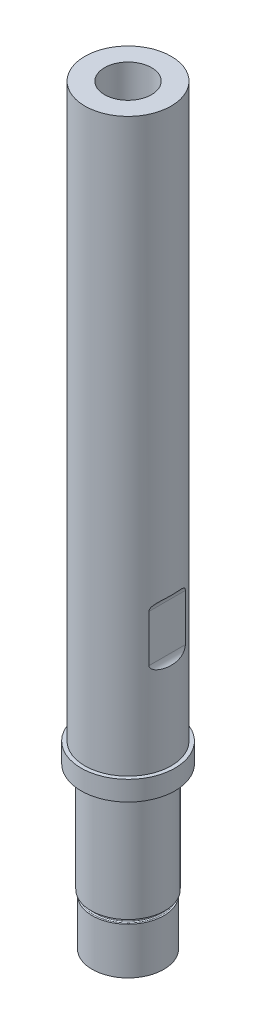
ISO-10303-21;
HEADER;
FILE_DESCRIPTION(('STEP AP214'),'2;1');
FILE_NAME('part.step','',(''),(''),'','','');
FILE_SCHEMA(('AUTOMOTIVE_DESIGN { 1 0 10303 214 1 1 1 1 }'));
ENDSEC;
DATA;
#1=APPLICATION_CONTEXT('core data for automotive mechanical design processes');
#2=APPLICATION_PROTOCOL_DEFINITION('international standard','automotive_design',2000,#1);
#3=PRODUCT_CONTEXT('',#1,'mechanical');
#4=PRODUCT('Part','Part','',(#3));
#5=PRODUCT_RELATED_PRODUCT_CATEGORY('part','',(#4));
#6=PRODUCT_DEFINITION_FORMATION('','',#4);
#7=PRODUCT_DEFINITION_CONTEXT('part definition',#1,'design');
#8=PRODUCT_DEFINITION('design','',#6,#7);
#9=PRODUCT_DEFINITION_SHAPE('','',#8);
#10=(LENGTH_UNIT() NAMED_UNIT(*) SI_UNIT(.MILLI.,.METRE.));
#11=(NAMED_UNIT(*) PLANE_ANGLE_UNIT() SI_UNIT($,.RADIAN.));
#12=(NAMED_UNIT(*) SI_UNIT($,.STERADIAN.) SOLID_ANGLE_UNIT());
#13=UNCERTAINTY_MEASURE_WITH_UNIT(LENGTH_MEASURE(1.E-05),#10,'distance_accuracy_value','');
#14=(GEOMETRIC_REPRESENTATION_CONTEXT(3) GLOBAL_UNCERTAINTY_ASSIGNED_CONTEXT((#13)) GLOBAL_UNIT_ASSIGNED_CONTEXT((#10,
#11,#12)) REPRESENTATION_CONTEXT('',''));
#15=CARTESIAN_POINT('',(0.,0.,0.));
#16=DIRECTION('',(0.,0.,1.));
#17=DIRECTION('',(1.,0.,0.));
#18=AXIS2_PLACEMENT_3D('',#15,#16,#17);
#19=CARTESIAN_POINT('',(0.,50.,0.));
#20=DIRECTION('',(0.,-1.,0.));
#21=DIRECTION('',(0.,0.,-1.));
#22=AXIS2_PLACEMENT_3D('',#19,#20,#21);
#23=PLANE('',#22);
#24=CARTESIAN_POINT('',(0.,50.,0.));
#25=DIRECTION('',(0.,-1.,0.));
#26=DIRECTION('',(0.,0.,-1.));
#27=AXIS2_PLACEMENT_3D('',#24,#25,#26);
#28=CIRCLE('',#27,15.);
#29=CARTESIAN_POINT('',(0.,50.,-15.));
#30=VERTEX_POINT('',#29);
#31=EDGE_CURVE('E258',#30,#30,#28,.T.);
#32=ORIENTED_EDGE('',*,*,#31,.F.);
#33=EDGE_LOOP('',(#32));
#34=FACE_BOUND('',#33,.T.);
#35=CARTESIAN_POINT('',(0.,50.,0.));
#36=DIRECTION('',(0.,-1.,0.));
#37=DIRECTION('',(0.,0.,-1.));
#38=AXIS2_PLACEMENT_3D('',#35,#36,#37);
#39=CIRCLE('',#38,19.05);
#40=CARTESIAN_POINT('',(0.,50.,-19.05));
#41=VERTEX_POINT('',#40);
#42=EDGE_CURVE('E250',#41,#41,#39,.T.);
#43=ORIENTED_EDGE('',*,*,#42,.T.);
#44=EDGE_LOOP('',(#43));
#45=FACE_BOUND('',#44,.T.);
#46=ADVANCED_FACE('F47',(#34,#45),#23,.T.);
#47=CARTESIAN_POINT('',(0.,58.,0.));
#48=DIRECTION('',(0.,1.,0.));
#49=DIRECTION('',(0.,0.,1.));
#50=AXIS2_PLACEMENT_3D('',#47,#48,#49);
#51=PLANE('',#50);
#52=CARTESIAN_POINT('',(0.,58.,0.));
#53=DIRECTION('',(0.,1.,0.));
#54=DIRECTION('',(0.,0.,1.));
#55=AXIS2_PLACEMENT_3D('',#52,#53,#54);
#56=CIRCLE('',#55,17.5);
#57=CARTESIAN_POINT('',(0.,58.,17.5));
#58=VERTEX_POINT('',#57);
#59=EDGE_CURVE('E255',#58,#58,#56,.T.);
#60=ORIENTED_EDGE('',*,*,#59,.F.);
#61=EDGE_LOOP('',(#60));
#62=FACE_BOUND('',#61,.T.);
#63=CARTESIAN_POINT('',(0.,58.,0.));
#64=DIRECTION('',(0.,1.,0.));
#65=DIRECTION('',(0.,0.,1.));
#66=AXIS2_PLACEMENT_3D('',#63,#64,#65);
#67=CIRCLE('',#66,19.05);
#68=CARTESIAN_POINT('',(0.,58.,-19.05));
#69=VERTEX_POINT('',#68);
#70=EDGE_CURVE('E244',#69,#69,#67,.T.);
#71=ORIENTED_EDGE('',*,*,#70,.T.);
#72=EDGE_LOOP('',(#71));
#73=FACE_BOUND('',#72,.T.);
#74=ADVANCED_FACE('F140',(#62,#73),#51,.T.);
#75=CARTESIAN_POINT('',(0.,50.,0.));
#76=DIRECTION('',(0.,-1.,0.));
#77=DIRECTION('',(0.,0.,-1.));
#78=AXIS2_PLACEMENT_3D('',#75,#76,#77);
#79=CYLINDRICAL_SURFACE('',#78,15.);
#80=ORIENTED_EDGE('',*,*,#31,.T.);
#81=EDGE_LOOP('',(#80));
#82=FACE_BOUND('',#81,.T.);
#83=CARTESIAN_POINT('',(0.,5.88,0.));
#84=DIRECTION('',(0.,-1.,0.));
#85=DIRECTION('',(0.,0.,-1.));
#86=AXIS2_PLACEMENT_3D('',#83,#84,#85);
#87=CIRCLE('',#86,15.);
#88=CARTESIAN_POINT('',(0.,5.88,-15.));
#89=VERTEX_POINT('',#88);
#90=EDGE_CURVE('E247',#89,#89,#87,.F.);
#91=ORIENTED_EDGE('',*,*,#90,.T.);
#92=EDGE_LOOP('',(#91));
#93=FACE_BOUND('',#92,.T.);
#94=ADVANCED_FACE('F165',(#82,#93),#79,.T.);
#95=CARTESIAN_POINT('',(0.,95.,0.));
#96=DIRECTION('',(0.,-1.,0.));
#97=DIRECTION('',(0.,0.,-1.));
#98=AXIS2_PLACEMENT_3D('',#95,#96,#97);
#99=CYLINDRICAL_SURFACE('',#98,9.525);
#100=CARTESIAN_POINT('',(0.,289.8,0.));
#101=DIRECTION('',(0.,-1.,0.));
#102=DIRECTION('',(0.,0.,-1.));
#103=AXIS2_PLACEMENT_3D('',#100,#101,#102);
#104=CIRCLE('',#103,9.525);
#105=CARTESIAN_POINT('',(0.,289.8,-9.525));
#106=VERTEX_POINT('',#105);
#107=EDGE_CURVE('E264',#106,#106,#104,.T.);
#108=ORIENTED_EDGE('',*,*,#107,.F.);
#109=EDGE_LOOP('',(#108));
#110=FACE_BOUND('',#109,.T.);
#111=CARTESIAN_POINT('',(0.,-15.,0.));
#112=DIRECTION('',(0.,-1.,0.));
#113=DIRECTION('',(0.,0.,-1.));
#114=AXIS2_PLACEMENT_3D('',#111,#112,#113);
#115=CIRCLE('',#114,9.525);
#116=CARTESIAN_POINT('',(0.,-15.,-9.525));
#117=VERTEX_POINT('',#116);
#118=EDGE_CURVE('E243',#117,#117,#115,.F.);
#119=ORIENTED_EDGE('',*,*,#118,.F.);
#120=EDGE_LOOP('',(#119));
#121=FACE_BOUND('',#120,.T.);
#122=ADVANCED_FACE('F138',(#110,#121),#99,.F.);
#123=CARTESIAN_POINT('',(0.,58.,0.));
#124=DIRECTION('',(0.,1.,0.));
#125=DIRECTION('',(0.,0.,1.));
#126=AXIS2_PLACEMENT_3D('',#123,#124,#125);
#127=CYLINDRICAL_SURFACE('',#126,17.5);
#128=DIRECTION('',(0.,1.,0.));
#129=VECTOR('',#128,1.);
#130=CARTESIAN_POINT('',(-15.875,58.,-7.36439916082773));
#131=LINE('',#130,#129);
#132=CARTESIAN_POINT('',(-15.875,115.15,-7.36439916082773));
#133=VERTEX_POINT('',#132);
#134=CARTESIAN_POINT('',(-15.875,96.1,-7.36439916082773));
#135=VERTEX_POINT('',#134);
#136=EDGE_CURVE('E203',#133,#135,#131,.F.);
#137=ORIENTED_EDGE('',*,*,#136,.F.);
#138=CARTESIAN_POINT('',(-15.875,115.15,-7.36439916082773));
#139=CARTESIAN_POINT('',(-15.874995418408,115.190447288888,-7.3644067448665));
#140=CARTESIAN_POINT('',(-15.8757736372352,115.230871605119,-7.36273166470119));
#141=CARTESIAN_POINT('',(-15.8788481879072,115.311359333157,-7.35609956469363));
#142=CARTESIAN_POINT('',(-15.8811432671816,115.351423015118,-7.35114525272191));
#143=CARTESIAN_POINT('',(-15.8901771507814,115.469947194259,-7.33160848042131));
#144=CARTESIAN_POINT('',(-15.8990665532658,115.547518339546,-7.31234864524993));
#145=CARTESIAN_POINT('',(-15.9217150724437,115.697953238873,-7.26289944335332));
#146=CARTESIAN_POINT('',(-15.9354595670734,115.770830359127,-7.23274288805618));
#147=CARTESIAN_POINT('',(-15.9667919868416,115.911346994648,-7.16331024558689));
#148=CARTESIAN_POINT('',(-15.9843888630621,115.978973806576,-7.12401290611304));
#149=CARTESIAN_POINT('',(-16.0350768116566,116.151777677883,-7.00944898783279));
#150=CARTESIAN_POINT('',(-16.0706711288955,116.251896334508,-6.92767950401977));
#151=CARTESIAN_POINT('',(-16.1459425275667,116.437301309306,-6.75039802053649));
#152=CARTESIAN_POINT('',(-16.1856304966866,116.522546361248,-6.65484908920575));
#153=CARTESIAN_POINT('',(-16.2615579369809,116.670263715498,-6.46689378447925));
#154=CARTESIAN_POINT('',(-16.297610868608,116.734250073657,-6.37557945434673));
#155=CARTESIAN_POINT('',(-16.3699159390601,116.853718148306,-6.18756872948341));
#156=CARTESIAN_POINT('',(-16.406168213752,116.909193045953,-6.09086810325059));
#157=CARTESIAN_POINT('',(-16.4781795989112,117.012888159426,-5.89327429405512));
#158=CARTESIAN_POINT('',(-16.5139377126589,117.061095237955,-5.79237392984439));
#159=CARTESIAN_POINT('',(-16.5844086869038,117.151188144147,-5.58740926763039));
#160=CARTESIAN_POINT('',(-16.6191211377729,117.193071519691,-5.48334376098767));
#161=CARTESIAN_POINT('',(-16.6880919078433,117.272465105161,-5.26977526419546));
#162=CARTESIAN_POINT('',(-16.7223100043233,117.309819211271,-5.16020166091232));
#163=CARTESIAN_POINT('',(-16.7889916018216,117.379525506033,-4.93894011793265));
#164=CARTESIAN_POINT('',(-16.8214547287638,117.411876631,-4.8272517342624));
#165=CARTESIAN_POINT('',(-16.9159505815296,117.502473837765,-4.48945889766233));
#166=CARTESIAN_POINT('',(-16.9750431145835,117.554212538168,-4.26077058877622));
#167=CARTESIAN_POINT('',(-17.0843959526613,117.644396172852,-3.79867173349907));
#168=CARTESIAN_POINT('',(-17.1346509674803,117.682833157858,-3.56525845128613));
#169=CARTESIAN_POINT('',(-17.2257572842121,117.749218436511,-3.09524789518142));
#170=CARTESIAN_POINT('',(-17.2666123363051,117.777170915838,-2.85865193105745));
#171=CARTESIAN_POINT('',(-17.3353213402488,117.822456450117,-2.40506077013286));
#172=CARTESIAN_POINT('',(-17.3640257674717,117.840530073412,-2.18826559903812));
#173=CARTESIAN_POINT('',(-17.4133189660449,117.870797118836,-1.75334489492602));
#174=CARTESIAN_POINT('',(-17.43390752772,117.882990389045,-1.53521932768538));
#175=CARTESIAN_POINT('',(-17.4669124410577,117.902239517933,-1.09779523137714));
#176=CARTESIAN_POINT('',(-17.4793162870457,117.909287516735,-0.878495421118675));
#177=CARTESIAN_POINT('',(-17.495860419537,117.918639706584,-0.43946297867798));
#178=CARTESIAN_POINT('',(-17.4999999235753,117.920943448448,-0.219730307483935));
#179=CARTESIAN_POINT('',(-17.5000000704574,117.92094254868,0.20257370133399));
#180=CARTESIAN_POINT('',(-17.4964818925672,117.918983686133,0.405145393665777));
#181=CARTESIAN_POINT('',(-17.482418982917,117.911047078316,0.809965112876743));
#182=CARTESIAN_POINT('',(-17.4718743598264,117.9050693952,1.0122131447131));
#183=CARTESIAN_POINT('',(-17.4437734890805,117.888781838618,1.41627102002008));
#184=CARTESIAN_POINT('',(-17.4262096098581,117.878467249287,1.61808014539533));
#185=CARTESIAN_POINT('',(-17.3841270557103,117.852979624842,2.02066431251058));
#186=CARTESIAN_POINT('',(-17.359608543649,117.8378067035,2.22143937835417));
#187=CARTESIAN_POINT('',(-17.3038595661522,117.801926303144,2.62045898861943));
#188=CARTESIAN_POINT('',(-17.2726658032377,117.781248943277,2.81871132964192));
#189=CARTESIAN_POINT('',(-17.2036289843931,117.733275055775,3.21329478067366));
#190=CARTESIAN_POINT('',(-17.1657849059668,117.705977510031,3.40962559033699));
#191=CARTESIAN_POINT('',(-17.0837596830235,117.643427715102,3.79930606299128));
#192=CARTESIAN_POINT('',(-17.0395903754571,117.608190255467,3.99266056354052));
#193=CARTESIAN_POINT('',(-16.9452436765575,117.527914500845,4.37579535758973));
#194=CARTESIAN_POINT('',(-16.895069234648,117.482881008369,4.56557735315024));
#195=CARTESIAN_POINT('',(-16.8177231491144,117.408033364913,4.83966175193735));
#196=CARTESIAN_POINT('',(-16.7926658752033,117.383030671673,4.92588544234827));
#197=CARTESIAN_POINT('',(-16.7414930070392,117.330085561934,5.09709754981174));
#198=CARTESIAN_POINT('',(-16.7153774505346,117.302143250233,5.18208601077774));
#199=CARTESIAN_POINT('',(-16.6354226413827,117.213215747683,5.4354439780168));
#200=CARTESIAN_POINT('',(-16.5801198565296,117.147264892269,5.60169535530701));
#201=CARTESIAN_POINT('',(-16.4886621100116,117.027092565156,5.86390047686047));
#202=CARTESIAN_POINT('',(-16.4532528957445,116.977997899787,5.96247187404391));
#203=CARTESIAN_POINT('',(-16.3820086921939,116.872358345797,6.15551461022438));
#204=CARTESIAN_POINT('',(-16.3461734746004,116.815809281664,6.24998361158208));
#205=CARTESIAN_POINT('',(-16.2750407684857,116.694394253351,6.43293330698811));
#206=CARTESIAN_POINT('',(-16.2397414741402,116.629571944076,6.52144195303293));
#207=CARTESIAN_POINT('',(-16.170646602796,116.490147222752,6.69092894694081));
#208=CARTESIAN_POINT('',(-16.1368486712895,116.415560904605,6.77191931961305));
#209=CARTESIAN_POINT('',(-16.0777218195743,116.268643248416,6.91097624935466));
#210=CARTESIAN_POINT('',(-16.0519200601003,116.198006557334,6.97061395549501));
#211=CARTESIAN_POINT('',(-16.0037738534276,116.048493877724,7.08045318392768));
#212=CARTESIAN_POINT('',(-15.9814304847373,115.969615331746,7.13065176364734));
#213=CARTESIAN_POINT('',(-15.9416417437509,115.802819508223,7.21917263007495));
#214=CARTESIAN_POINT('',(-15.9242624279822,115.714799841832,7.25733539408445));
#215=CARTESIAN_POINT('',(-15.89677580349,115.532374754132,7.31735244424725));
#216=CARTESIAN_POINT('',(-15.8866429557346,115.437993055067,7.33926401539477));
#217=CARTESIAN_POINT('',(-15.8788933136537,115.310443175135,7.3560015389103));
#218=CARTESIAN_POINT('',(-15.8774366563998,115.278457646641,7.35914462760885));
#219=CARTESIAN_POINT('',(-15.8754902859441,115.21432098634,7.36334261925571));
#220=CARTESIAN_POINT('',(-15.8750005645357,115.18216985594,7.36439753992674));
#221=CARTESIAN_POINT('',(-15.875,115.15,7.36439916082767));
#222=B_SPLINE_CURVE_WITH_KNOTS('',3,(#138,#139,#140,#141,#142,#143,#144,#145,#146,#147,#148,
#149,#150,#151,#152,#153,#154,#155,#156,#157,#158,#159,#160,#161,#162,#163,#164,#165,#166,#167,
#168,#169,#170,#171,#172,#173,#174,#175,#176,#177,#178,#179,#180,#181,#182,#183,#184,#185,#186,
#187,#188,#189,#190,#191,#192,#193,#194,#195,#196,#197,#198,#199,#200,#201,#202,#203,#204,#205,
#206,#207,#208,#209,#210,#211,#212,#213,#214,#215,#216,#217,#218,#219,#220,#221),.UNSPECIFIED.,
.F.,.F.,(4,2,2,2,2,2,2,2,2,2,2,2,2,2,2,2,2,2,2,2,2,2,2,2,2,2,2,2,2,2,2,2,2,2,2,2,2,2,2,2,2,4),
(0.,0.121256634055323,0.242413263497249,0.4824272660715,0.721724497248479,0.961583755505207,
1.36151105305211,1.76253087437694,2.11357987101965,2.46490865372873,2.81686507375418,
3.16895762208022,3.53095162883181,3.89302249368914,4.61764151703332,5.3426928370781,
6.06745438934742,6.72551523226685,7.38359307523461,8.04267410118319,8.70181752572409,
9.30949484046574,9.91716275721932,10.5254931558527,11.1338093097398,11.7388629664671,
12.3440097326551,12.9480384855854,13.5517717777326,13.8313370703746,14.1108923998064,
14.6716423476577,15.0184236166387,15.3653999639178,15.7106157894548,16.0552696004983,
16.3425019267208,16.6298236474237,16.9208074000042,17.2107605036149,17.3072132439078,
17.4036651655826),.UNSPECIFIED.);
#223=CARTESIAN_POINT('',(-15.875,115.15,7.36439916082773));
#224=VERTEX_POINT('',#223);
#225=EDGE_CURVE('E85',#133,#224,#222,.T.);
#226=ORIENTED_EDGE('',*,*,#225,.T.);
#227=DIRECTION('',(0.,1.,0.));
#228=VECTOR('',#227,1.);
#229=CARTESIAN_POINT('',(-15.875,58.,7.36439916082773));
#230=LINE('',#229,#228);
#231=CARTESIAN_POINT('',(-15.875,96.1,7.36439916082773));
#232=VERTEX_POINT('',#231);
#233=EDGE_CURVE('E111',#232,#224,#230,.T.);
#234=ORIENTED_EDGE('',*,*,#233,.F.);
#235=CARTESIAN_POINT('',(-15.875,96.1,7.36439916082773));
#236=CARTESIAN_POINT('',(-15.874995418408,96.0595527111125,7.36440674486653));
#237=CARTESIAN_POINT('',(-15.8757736372352,96.0191283948811,7.36273166470124));
#238=CARTESIAN_POINT('',(-15.8788481879072,95.9386406668433,7.35609956469369));
#239=CARTESIAN_POINT('',(-15.8811432671816,95.8985769848824,7.35114525272196));
#240=CARTESIAN_POINT('',(-15.8901771507813,95.7800528057411,7.33160848042135));
#241=CARTESIAN_POINT('',(-15.8990665532657,95.7024816604536,7.31234864524997));
#242=CARTESIAN_POINT('',(-15.9217150724436,95.5520467611272,7.26289944335337));
#243=CARTESIAN_POINT('',(-15.9354595670734,95.4791696408734,7.23274288805623));
#244=CARTESIAN_POINT('',(-15.9667919868416,95.3386530053516,7.16331024558694));
#245=CARTESIAN_POINT('',(-15.9843888630621,95.2710261934243,7.1240129061131));
#246=CARTESIAN_POINT('',(-16.0350768116566,95.0982223221166,7.00944898783285));
#247=CARTESIAN_POINT('',(-16.0706711288955,94.9981036654924,6.92767950401983));
#248=CARTESIAN_POINT('',(-16.1459425275667,94.8126986906939,6.75039802053655));
#249=CARTESIAN_POINT('',(-16.1856304966866,94.7274536387522,6.65484908920581));
#250=CARTESIAN_POINT('',(-16.2615579369809,94.5797362845016,6.46689378447932));
#251=CARTESIAN_POINT('',(-16.297610868608,94.5157499263435,6.37557945434679));
#252=CARTESIAN_POINT('',(-16.36991593906,94.396281851694,6.18756872948348));
#253=CARTESIAN_POINT('',(-16.406168213752,94.3408069540471,6.09086810325065));
#254=CARTESIAN_POINT('',(-16.4781795989111,94.2371118405745,5.89327429405519));
#255=CARTESIAN_POINT('',(-16.5139377126589,94.1889047620454,5.79237392984446));
#256=CARTESIAN_POINT('',(-16.5844086869038,94.0988118558526,5.58740926763046));
#257=CARTESIAN_POINT('',(-16.6191211377728,94.0569284803085,5.48334376098775));
#258=CARTESIAN_POINT('',(-16.6880919078433,93.9775348948394,5.26977526419554));
#259=CARTESIAN_POINT('',(-16.7223100043233,93.9401807887289,5.16020166091241));
#260=CARTESIAN_POINT('',(-16.7889916018215,93.870474493967,4.93894011793274));
#261=CARTESIAN_POINT('',(-16.8214547287637,93.8381233690001,4.82725173426249));
#262=CARTESIAN_POINT('',(-16.9159505815295,93.7475261622354,4.48945889766243));
#263=CARTESIAN_POINT('',(-16.9750431145835,93.6957874618315,4.26077058877631));
#264=CARTESIAN_POINT('',(-17.0843959526613,93.6056038271479,3.79867173349916));
#265=CARTESIAN_POINT('',(-17.1346509674803,93.5671668421415,3.56525845128622));
#266=CARTESIAN_POINT('',(-17.2257572842121,93.5007815634891,3.09524789518152));
#267=CARTESIAN_POINT('',(-17.2666123363051,93.4728290841619,2.85865193105755));
#268=CARTESIAN_POINT('',(-17.3353213402488,93.4275435498829,2.40506077013295));
#269=CARTESIAN_POINT('',(-17.3640257674717,93.4094699265876,2.1882655990382));
#270=CARTESIAN_POINT('',(-17.4133189660449,93.3792028811642,1.75334489492609));
#271=CARTESIAN_POINT('',(-17.43390752772,93.3670096109547,1.53521932768544));
#272=CARTESIAN_POINT('',(-17.4669124410577,93.3477604820668,1.09779523137718));
#273=CARTESIAN_POINT('',(-17.4793162870457,93.340712483265,0.878495421118711));
#274=CARTESIAN_POINT('',(-17.495860419537,93.3313602934158,0.439462978678));
#275=CARTESIAN_POINT('',(-17.4999999235753,93.3290565515523,0.219730307483947));
#276=CARTESIAN_POINT('',(-17.5000000704574,93.3290574513203,-0.202573701333987));
#277=CARTESIAN_POINT('',(-17.4964818925672,93.3310163138669,-0.405145393665775));
#278=CARTESIAN_POINT('',(-17.482418982917,93.3389529216841,-0.809965112876744));
#279=CARTESIAN_POINT('',(-17.4718743598264,93.3449306048004,-1.0122131447131));
#280=CARTESIAN_POINT('',(-17.4437734890805,93.3612181613819,-1.41627102002008));
#281=CARTESIAN_POINT('',(-17.4262096098581,93.3715327507128,-1.61808014539533));
#282=CARTESIAN_POINT('',(-17.3841270557103,93.3970203751577,-2.02066431251059));
#283=CARTESIAN_POINT('',(-17.359608543649,93.4121932965001,-2.22143937835418));
#284=CARTESIAN_POINT('',(-17.3038595661522,93.4480736968565,-2.62045898861944));
#285=CARTESIAN_POINT('',(-17.2726658032377,93.4687510567233,-2.81871132964193));
#286=CARTESIAN_POINT('',(-17.2036289843931,93.5167249442248,-3.21329478067367));
#287=CARTESIAN_POINT('',(-17.1657849059668,93.544022489969,-3.40962559033701));
#288=CARTESIAN_POINT('',(-17.0837596830235,93.6065722848979,-3.7993060629913));
#289=CARTESIAN_POINT('',(-17.0395903754571,93.6418097445332,-3.99266056354054));
#290=CARTESIAN_POINT('',(-16.9452436765575,93.7220854991555,-4.37579535758975));
#291=CARTESIAN_POINT('',(-16.8950692346479,93.7671189916308,-4.56557735315027));
#292=CARTESIAN_POINT('',(-16.8177231491144,93.8419666350875,-4.83966175193738));
#293=CARTESIAN_POINT('',(-16.7926658752033,93.8669693283272,-4.9258854423483));
#294=CARTESIAN_POINT('',(-16.7414930070392,93.9199144380661,-5.09709754981178));
#295=CARTESIAN_POINT('',(-16.7153774505346,93.947856749767,-5.18208601077778));
#296=CARTESIAN_POINT('',(-16.6354226413827,94.0367842523169,-5.43544397801684));
#297=CARTESIAN_POINT('',(-16.5801198565296,94.1027351077313,-5.60169535530706));
#298=CARTESIAN_POINT('',(-16.4886621100116,94.2229074348436,-5.86390047686053));
#299=CARTESIAN_POINT('',(-16.4532528957444,94.272002100213,-5.96247187404397));
#300=CARTESIAN_POINT('',(-16.3820086921939,94.3776416542034,-6.15551461022443));
#301=CARTESIAN_POINT('',(-16.3461734746004,94.4341907183361,-6.24998361158213));
#302=CARTESIAN_POINT('',(-16.2750407684857,94.5556057466486,-6.43293330698815));
#303=CARTESIAN_POINT('',(-16.2397414741402,94.6204280559235,-6.52144195303297));
#304=CARTESIAN_POINT('',(-16.170646602796,94.7598527772477,-6.69092894694085));
#305=CARTESIAN_POINT('',(-16.1368486712895,94.834439095395,-6.77191931961309));
#306=CARTESIAN_POINT('',(-16.0777218195742,94.9813567515839,-6.91097624935469));
#307=CARTESIAN_POINT('',(-16.0519200601003,95.051993442666,-6.97061395549505));
#308=CARTESIAN_POINT('',(-16.0037738534276,95.201506122276,-7.08045318392772));
#309=CARTESIAN_POINT('',(-15.9814304847373,95.2803846682544,-7.13065176364738));
#310=CARTESIAN_POINT('',(-15.9416417437508,95.4471804917772,-7.21917263007501));
#311=CARTESIAN_POINT('',(-15.9242624279822,95.5352001581677,-7.25733539408452));
#312=CARTESIAN_POINT('',(-15.89677580349,95.7176252458681,-7.31735244424731));
#313=CARTESIAN_POINT('',(-15.8866429557345,95.8120069449331,-7.33926401539482));
#314=CARTESIAN_POINT('',(-15.8788933136537,95.9395568248649,-7.35600153891036));
#315=CARTESIAN_POINT('',(-15.8774366563998,95.9715423533588,-7.35914462760891));
#316=CARTESIAN_POINT('',(-15.8754902859441,96.0356790136603,-7.36334261925577));
#317=CARTESIAN_POINT('',(-15.8750005645356,96.0678301440601,-7.3643975399268));
#318=CARTESIAN_POINT('',(-15.875,96.1,-7.36439916082772));
#319=B_SPLINE_CURVE_WITH_KNOTS('',3,(#235,#236,#237,#238,#239,#240,#241,#242,#243,#244,#245,
#246,#247,#248,#249,#250,#251,#252,#253,#254,#255,#256,#257,#258,#259,#260,#261,#262,#263,#264,
#265,#266,#267,#268,#269,#270,#271,#272,#273,#274,#275,#276,#277,#278,#279,#280,#281,#282,#283,
#284,#285,#286,#287,#288,#289,#290,#291,#292,#293,#294,#295,#296,#297,#298,#299,#300,#301,#302,
#303,#304,#305,#306,#307,#308,#309,#310,#311,#312,#313,#314,#315,#316,#317,#318),.UNSPECIFIED.,
.F.,.F.,(4,2,2,2,2,2,2,2,2,2,2,2,2,2,2,2,2,2,2,2,2,2,2,2,2,2,2,2,2,2,2,2,2,2,2,2,2,2,2,2,2,4),
(0.,0.12125663405532,0.242413263497248,0.482427266071498,0.72172449724849,0.9615837555052,
1.36151105305212,1.76253087437694,2.11357987101964,2.46490865372872,2.81686507375416,
3.1689576220802,3.53095162883178,3.8930224936891,4.61764151703329,5.34269283707807,
6.06745438934739,6.72551523226683,7.38359307523462,8.04267410118322,8.70181752572414,
9.3094948404658,9.91716275721938,10.5254931558527,11.1338093097398,11.7388629664671,
12.3440097326551,12.9480384855854,13.5517717777327,13.8313370703747,14.1108923998065,
14.6716423476578,15.0184236166388,15.3653999639179,15.7106157894549,16.0552696004984,
16.3425019267209,16.6298236474238,16.9208074000044,17.210760503615,17.3072132439079,
17.4036651655827),.UNSPECIFIED.);
#320=EDGE_CURVE('E92',#232,#135,#319,.T.);
#321=ORIENTED_EDGE('',*,*,#320,.T.);
#322=EDGE_LOOP('',(#137,#226,#234,#321));
#323=FACE_BOUND('',#322,.T.);
#324=DIRECTION('',(0.,1.,0.));
#325=VECTOR('',#324,1.);
#326=CARTESIAN_POINT('',(15.875,58.,7.36439916082775));
#327=LINE('',#326,#325);
#328=CARTESIAN_POINT('',(15.875,115.15,7.36439916082775));
#329=VERTEX_POINT('',#328);
#330=CARTESIAN_POINT('',(15.875,96.1,7.36439916082775));
#331=VERTEX_POINT('',#330);
#332=EDGE_CURVE('E102',#329,#331,#327,.F.);
#333=ORIENTED_EDGE('',*,*,#332,.F.);
#334=CARTESIAN_POINT('',(15.875,115.15,7.36439916082775));
#335=CARTESIAN_POINT('',(15.874995418408,115.190447288888,7.36440674486655));
#336=CARTESIAN_POINT('',(15.8757736372351,115.230871605119,7.36273166470126));
#337=CARTESIAN_POINT('',(15.8788481879072,115.311359333157,7.35609956469371));
#338=CARTESIAN_POINT('',(15.8811432671816,115.351423015118,7.35114525272197));
#339=CARTESIAN_POINT('',(15.8901771507813,115.469947194259,7.33160848042137));
#340=CARTESIAN_POINT('',(15.8990665532657,115.547518339546,7.31234864524999));
#341=CARTESIAN_POINT('',(15.9217150724436,115.697953238873,7.26289944335338));
#342=CARTESIAN_POINT('',(15.9354595670734,115.770830359127,7.23274288805624));
#343=CARTESIAN_POINT('',(15.9667919868416,115.911346994648,7.16331024558694));
#344=CARTESIAN_POINT('',(15.9843888630621,115.978973806576,7.1240129061131));
#345=CARTESIAN_POINT('',(16.0350768116566,116.151777677883,7.00944898783286));
#346=CARTESIAN_POINT('',(16.0706711288955,116.251896334508,6.92767950401983));
#347=CARTESIAN_POINT('',(16.1459425275667,116.437301309306,6.75039802053655));
#348=CARTESIAN_POINT('',(16.1856304966866,116.522546361248,6.65484908920582));
#349=CARTESIAN_POINT('',(16.2615579369809,116.670263715498,6.46689378447931));
#350=CARTESIAN_POINT('',(16.297610868608,116.734250073657,6.37557945434678));
#351=CARTESIAN_POINT('',(16.36991593906,116.853718148306,6.18756872948346));
#352=CARTESIAN_POINT('',(16.406168213752,116.909193045953,6.09086810325064));
#353=CARTESIAN_POINT('',(16.4781795989111,117.012888159426,5.89327429405517));
#354=CARTESIAN_POINT('',(16.5139377126589,117.061095237955,5.79237392984444));
#355=CARTESIAN_POINT('',(16.5844086869038,117.151188144147,5.58740926763043));
#356=CARTESIAN_POINT('',(16.6191211377728,117.193071519692,5.48334376098772));
#357=CARTESIAN_POINT('',(16.6880919078433,117.272465105161,5.2697752641955));
#358=CARTESIAN_POINT('',(16.7223100043233,117.309819211271,5.16020166091237));
#359=CARTESIAN_POINT('',(16.7889916018215,117.379525506033,4.9389401179327));
#360=CARTESIAN_POINT('',(16.8214547287637,117.411876631,4.82725173426244));
#361=CARTESIAN_POINT('',(16.9159505815295,117.502473837765,4.48945889766238));
#362=CARTESIAN_POINT('',(16.9750431145835,117.554212538169,4.26077058877626));
#363=CARTESIAN_POINT('',(17.0843959526613,117.644396172852,3.79867173349911));
#364=CARTESIAN_POINT('',(17.1346509674803,117.682833157859,3.56525845128617));
#365=CARTESIAN_POINT('',(17.2257572842121,117.749218436511,3.09524789518146));
#366=CARTESIAN_POINT('',(17.2666123363051,117.777170915838,2.85865193105749));
#367=CARTESIAN_POINT('',(17.3353213402488,117.822456450117,2.4050607701329));
#368=CARTESIAN_POINT('',(17.3640257674717,117.840530073412,2.18826559903815));
#369=CARTESIAN_POINT('',(17.4133189660449,117.870797118836,1.75334489492605));
#370=CARTESIAN_POINT('',(17.43390752772,117.882990389045,1.5352193276854));
#371=CARTESIAN_POINT('',(17.4669124410577,117.902239517933,1.09779523137715));
#372=CARTESIAN_POINT('',(17.4793162870457,117.909287516735,0.878495421118687));
#373=CARTESIAN_POINT('',(17.495860419537,117.918639706584,0.439462978677986));
#374=CARTESIAN_POINT('',(17.4999999235753,117.920943448448,0.219730307483937));
#375=CARTESIAN_POINT('',(17.5000000704574,117.92094254868,-0.202573701333992));
#376=CARTESIAN_POINT('',(17.4964818925672,117.918983686133,-0.40514539366578));
#377=CARTESIAN_POINT('',(17.482418982917,117.911047078316,-0.809965112876749));
#378=CARTESIAN_POINT('',(17.4718743598264,117.9050693952,-1.0122131447131));
#379=CARTESIAN_POINT('',(17.4437734890805,117.888781838618,-1.41627102002009));
#380=CARTESIAN_POINT('',(17.4262096098581,117.878467249287,-1.61808014539534));
#381=CARTESIAN_POINT('',(17.3841270557103,117.852979624842,-2.0206643125106));
#382=CARTESIAN_POINT('',(17.359608543649,117.8378067035,-2.22143937835419));
#383=CARTESIAN_POINT('',(17.3038595661522,117.801926303144,-2.62045898861945));
#384=CARTESIAN_POINT('',(17.2726658032377,117.781248943277,-2.81871132964194));
#385=CARTESIAN_POINT('',(17.2036289843931,117.733275055775,-3.21329478067368));
#386=CARTESIAN_POINT('',(17.1657849059668,117.705977510031,-3.40962559033702));
#387=CARTESIAN_POINT('',(17.0837596830235,117.643427715102,-3.79930606299131));
#388=CARTESIAN_POINT('',(17.0395903754571,117.608190255467,-3.99266056354056));
#389=CARTESIAN_POINT('',(16.9452436765575,117.527914500845,-4.37579535758977));
#390=CARTESIAN_POINT('',(16.8950692346479,117.482881008369,-4.56557735315029));
#391=CARTESIAN_POINT('',(16.8177231491144,117.408033364913,-4.8396617519374));
#392=CARTESIAN_POINT('',(16.7926658752033,117.383030671673,-4.92588544234832));
#393=CARTESIAN_POINT('',(16.7414930070392,117.330085561934,-5.0970975498118));
#394=CARTESIAN_POINT('',(16.7153774505346,117.302143250233,-5.1820860107778));
#395=CARTESIAN_POINT('',(16.6354226413827,117.213215747683,-5.43544397801687));
#396=CARTESIAN_POINT('',(16.5801198565295,117.147264892269,-5.60169535530708));
#397=CARTESIAN_POINT('',(16.4886621100116,117.027092565156,-5.86390047686055));
#398=CARTESIAN_POINT('',(16.4532528957444,116.977997899787,-5.96247187404399));
#399=CARTESIAN_POINT('',(16.3820086921939,116.872358345797,-6.15551461022445));
#400=CARTESIAN_POINT('',(16.3461734746004,116.815809281664,-6.24998361158215));
#401=CARTESIAN_POINT('',(16.2750407684857,116.694394253351,-6.43293330698817));
#402=CARTESIAN_POINT('',(16.2397414741402,116.629571944076,-6.521441953033));
#403=CARTESIAN_POINT('',(16.1706466027959,116.490147222752,-6.69092894694087));
#404=CARTESIAN_POINT('',(16.1368486712895,116.415560904605,-6.77191931961311));
#405=CARTESIAN_POINT('',(16.0777218195742,116.268643248416,-6.91097624935471));
#406=CARTESIAN_POINT('',(16.0519200601003,116.198006557334,-6.97061395549506));
#407=CARTESIAN_POINT('',(16.0037738534276,116.048493877724,-7.08045318392774));
#408=CARTESIAN_POINT('',(15.9814304847373,115.969615331746,-7.1306517636474));
#409=CARTESIAN_POINT('',(15.9416417437508,115.802819508223,-7.21917263007501));
#410=CARTESIAN_POINT('',(15.9242624279822,115.714799841832,-7.25733539408452));
#411=CARTESIAN_POINT('',(15.89677580349,115.532374754132,-7.31735244424732));
#412=CARTESIAN_POINT('',(15.8866429557345,115.437993055067,-7.33926401539484));
#413=CARTESIAN_POINT('',(15.8788933136537,115.310443175135,-7.35600153891037));
#414=CARTESIAN_POINT('',(15.8774366563998,115.278457646641,-7.35914462760892));
#415=CARTESIAN_POINT('',(15.875490285944,115.21432098634,-7.36334261925578));
#416=CARTESIAN_POINT('',(15.8750005645356,115.18216985594,-7.36439753992681));
#417=CARTESIAN_POINT('',(15.875,115.15,-7.36439916082774));
#418=B_SPLINE_CURVE_WITH_KNOTS('',3,(#334,#335,#336,#337,#338,#339,#340,#341,#342,#343,#344,
#345,#346,#347,#348,#349,#350,#351,#352,#353,#354,#355,#356,#357,#358,#359,#360,#361,#362,#363,
#364,#365,#366,#367,#368,#369,#370,#371,#372,#373,#374,#375,#376,#377,#378,#379,#380,#381,#382,
#383,#384,#385,#386,#387,#388,#389,#390,#391,#392,#393,#394,#395,#396,#397,#398,#399,#400,#401,
#402,#403,#404,#405,#406,#407,#408,#409,#410,#411,#412,#413,#414,#415,#416,#417),.UNSPECIFIED.,
.F.,.F.,(4,2,2,2,2,2,2,2,2,2,2,2,2,2,2,2,2,2,2,2,2,2,2,2,2,2,2,2,2,2,2,2,2,2,2,2,2,2,2,2,2,4),
(0.,0.12125663405532,0.242413263497248,0.482427266071512,0.721724497248524,0.961583755505218,
1.36151105305212,1.76253087437696,2.11357987101967,2.46490865372876,2.8168650737542,
3.16895762208025,3.53095162883184,3.89302249368917,4.61764151703336,5.34269283707814,
6.06745438934747,6.7255152322669,7.38359307523467,8.04267410118326,8.70181752572417,
9.30949484046582,9.9171627572194,10.5254931558527,11.1338093097399,11.7388629664672,
12.3440097326552,12.9480384855855,13.5517717777327,13.8313370703748,14.1108923998065,
14.6716423476578,15.0184236166388,15.3653999639179,15.7106157894549,16.0552696004984,
16.3425019267209,16.6298236474238,16.9208074000044,17.210760503615,17.3072132439079,
17.4036651655828),.UNSPECIFIED.);
#419=CARTESIAN_POINT('',(15.875,115.15,-7.36439916082775));
#420=VERTEX_POINT('',#419);
#421=EDGE_CURVE('E13',#329,#420,#418,.T.);
#422=ORIENTED_EDGE('',*,*,#421,.T.);
#423=DIRECTION('',(0.,1.,0.));
#424=VECTOR('',#423,1.);
#425=CARTESIAN_POINT('',(15.875,58.,-7.36439916082775));
#426=LINE('',#425,#424);
#427=CARTESIAN_POINT('',(15.875,96.1,-7.36439916082775));
#428=VERTEX_POINT('',#427);
#429=EDGE_CURVE('E103',#428,#420,#426,.T.);
#430=ORIENTED_EDGE('',*,*,#429,.F.);
#431=CARTESIAN_POINT('',(15.875,96.1,-7.36439916082775));
#432=CARTESIAN_POINT('',(15.874995418408,96.0595527111125,-7.36440674486655));
#433=CARTESIAN_POINT('',(15.8757736372351,96.0191283948811,-7.36273166470126));
#434=CARTESIAN_POINT('',(15.8788481879072,95.9386406668433,-7.35609956469371));
#435=CARTESIAN_POINT('',(15.8811432671816,95.8985769848824,-7.35114525272197));
#436=CARTESIAN_POINT('',(15.8901771507813,95.7800528057411,-7.33160848042137));
#437=CARTESIAN_POINT('',(15.8990665532657,95.7024816604536,-7.31234864524999));
#438=CARTESIAN_POINT('',(15.9217150724436,95.5520467611272,-7.26289944335339));
#439=CARTESIAN_POINT('',(15.9354595670734,95.4791696408734,-7.23274288805625));
#440=CARTESIAN_POINT('',(15.9667919868416,95.3386530053516,-7.16331024558696));
#441=CARTESIAN_POINT('',(15.9843888630621,95.2710261934243,-7.12401290611311));
#442=CARTESIAN_POINT('',(16.0350768116566,95.0982223221166,-7.00944898783286));
#443=CARTESIAN_POINT('',(16.0706711288955,94.9981036654924,-6.92767950401983));
#444=CARTESIAN_POINT('',(16.1459425275667,94.8126986906939,-6.75039802053655));
#445=CARTESIAN_POINT('',(16.1856304966866,94.7274536387522,-6.65484908920581));
#446=CARTESIAN_POINT('',(16.2615579369809,94.5797362845016,-6.46689378447932));
#447=CARTESIAN_POINT('',(16.297610868608,94.5157499263435,-6.3755794543468));
#448=CARTESIAN_POINT('',(16.36991593906,94.396281851694,-6.18756872948348));
#449=CARTESIAN_POINT('',(16.406168213752,94.3408069540471,-6.09086810325065));
#450=CARTESIAN_POINT('',(16.4781795989111,94.2371118405745,-5.89327429405517));
#451=CARTESIAN_POINT('',(16.5139377126589,94.1889047620454,-5.79237392984444));
#452=CARTESIAN_POINT('',(16.5844086869038,94.0988118558526,-5.58740926763043));
#453=CARTESIAN_POINT('',(16.6191211377728,94.0569284803085,-5.48334376098772));
#454=CARTESIAN_POINT('',(16.6880919078433,93.9775348948394,-5.2697752641955));
#455=CARTESIAN_POINT('',(16.7223100043233,93.9401807887289,-5.16020166091237));
#456=CARTESIAN_POINT('',(16.7889916018215,93.870474493967,-4.9389401179327));
#457=CARTESIAN_POINT('',(16.8214547287637,93.838123369,-4.82725173426245));
#458=CARTESIAN_POINT('',(16.9159505815295,93.7475261622353,-4.48945889766238));
#459=CARTESIAN_POINT('',(16.9750431145835,93.6957874618315,-4.26077058877626));
#460=CARTESIAN_POINT('',(17.0843959526613,93.6056038271479,-3.79867173349911));
#461=CARTESIAN_POINT('',(17.1346509674803,93.5671668421415,-3.56525845128617));
#462=CARTESIAN_POINT('',(17.2257572842121,93.500781563489,-3.09524789518146));
#463=CARTESIAN_POINT('',(17.2666123363051,93.4728290841619,-2.85865193105749));
#464=CARTESIAN_POINT('',(17.3353213402488,93.4275435498829,-2.4050607701329));
#465=CARTESIAN_POINT('',(17.3640257674717,93.4094699265876,-2.18826559903815));
#466=CARTESIAN_POINT('',(17.4133189660449,93.3792028811642,-1.75334489492604));
#467=CARTESIAN_POINT('',(17.43390752772,93.3670096109547,-1.5352193276854));
#468=CARTESIAN_POINT('',(17.4669124410577,93.3477604820668,-1.09779523137715));
#469=CARTESIAN_POINT('',(17.4793162870457,93.340712483265,-0.878495421118685));
#470=CARTESIAN_POINT('',(17.495860419537,93.3313602934158,-0.439462978677983));
#471=CARTESIAN_POINT('',(17.4999999235753,93.3290565515522,-0.219730307483935));
#472=CARTESIAN_POINT('',(17.5000000704574,93.3290574513203,0.202573701333995));
#473=CARTESIAN_POINT('',(17.4964818925672,93.3310163138669,0.405145393665782));
#474=CARTESIAN_POINT('',(17.482418982917,93.3389529216841,0.809965112876752));
#475=CARTESIAN_POINT('',(17.4718743598264,93.3449306048004,1.01221314471311));
#476=CARTESIAN_POINT('',(17.4437734890805,93.3612181613819,1.41627102002009));
#477=CARTESIAN_POINT('',(17.4262096098581,93.3715327507128,1.61808014539534));
#478=CARTESIAN_POINT('',(17.3841270557103,93.3970203751577,2.0206643125106));
#479=CARTESIAN_POINT('',(17.359608543649,93.4121932965001,2.22143937835419));
#480=CARTESIAN_POINT('',(17.3038595661522,93.4480736968565,2.62045898861946));
#481=CARTESIAN_POINT('',(17.2726658032377,93.4687510567233,2.81871132964195));
#482=CARTESIAN_POINT('',(17.2036289843931,93.5167249442248,3.21329478067369));
#483=CARTESIAN_POINT('',(17.1657849059668,93.544022489969,3.40962559033703));
#484=CARTESIAN_POINT('',(17.0837596830235,93.6065722848979,3.79930606299132));
#485=CARTESIAN_POINT('',(17.0395903754571,93.6418097445332,3.99266056354056));
#486=CARTESIAN_POINT('',(16.9452436765575,93.7220854991555,4.37579535758977));
#487=CARTESIAN_POINT('',(16.8950692346479,93.7671189916308,4.56557735315029));
#488=CARTESIAN_POINT('',(16.8177231491144,93.8419666350875,4.8396617519374));
#489=CARTESIAN_POINT('',(16.7926658752033,93.8669693283272,4.92588544234832));
#490=CARTESIAN_POINT('',(16.7414930070392,93.9199144380661,5.0970975498118));
#491=CARTESIAN_POINT('',(16.7153774505346,93.947856749767,5.1820860107778));
#492=CARTESIAN_POINT('',(16.6354226413827,94.0367842523169,5.43544397801686));
#493=CARTESIAN_POINT('',(16.5801198565295,94.1027351077313,5.60169535530708));
#494=CARTESIAN_POINT('',(16.4886621100116,94.2229074348436,5.86390047686055));
#495=CARTESIAN_POINT('',(16.4532528957444,94.272002100213,5.96247187404398));
#496=CARTESIAN_POINT('',(16.3820086921939,94.3776416542034,6.15551461022444));
#497=CARTESIAN_POINT('',(16.3461734746004,94.4341907183361,6.24998361158214));
#498=CARTESIAN_POINT('',(16.2750407684857,94.5556057466486,6.43293330698817));
#499=CARTESIAN_POINT('',(16.2397414741402,94.6204280559235,6.52144195303299));
#500=CARTESIAN_POINT('',(16.1706466027959,94.7598527772477,6.69092894694087));
#501=CARTESIAN_POINT('',(16.1368486712895,94.834439095395,6.77191931961311));
#502=CARTESIAN_POINT('',(16.0777218195742,94.9813567515839,6.91097624935471));
#503=CARTESIAN_POINT('',(16.0519200601003,95.051993442666,6.97061395549506));
#504=CARTESIAN_POINT('',(16.0037738534276,95.201506122276,7.08045318392774));
#505=CARTESIAN_POINT('',(15.9814304847373,95.2803846682544,7.1306517636474));
#506=CARTESIAN_POINT('',(15.9416417437508,95.4471804917772,7.21917263007502));
#507=CARTESIAN_POINT('',(15.9242624279822,95.5352001581677,7.25733539408453));
#508=CARTESIAN_POINT('',(15.89677580349,95.7176252458681,7.31735244424732));
#509=CARTESIAN_POINT('',(15.8866429557345,95.8120069449331,7.33926401539484));
#510=CARTESIAN_POINT('',(15.8788933136537,95.9395568248649,7.35600153891037));
#511=CARTESIAN_POINT('',(15.8774366563998,95.9715423533588,7.35914462760892));
#512=CARTESIAN_POINT('',(15.875490285944,96.0356790136603,7.36334261925578));
#513=CARTESIAN_POINT('',(15.8750005645356,96.0678301440601,7.36439753992681));
#514=CARTESIAN_POINT('',(15.875,96.1,7.36439916082774));
#515=B_SPLINE_CURVE_WITH_KNOTS('',3,(#431,#432,#433,#434,#435,#436,#437,#438,#439,#440,#441,
#442,#443,#444,#445,#446,#447,#448,#449,#450,#451,#452,#453,#454,#455,#456,#457,#458,#459,#460,
#461,#462,#463,#464,#465,#466,#467,#468,#469,#470,#471,#472,#473,#474,#475,#476,#477,#478,#479,
#480,#481,#482,#483,#484,#485,#486,#487,#488,#489,#490,#491,#492,#493,#494,#495,#496,#497,#498,
#499,#500,#501,#502,#503,#504,#505,#506,#507,#508,#509,#510,#511,#512,#513,#514),.UNSPECIFIED.,
.F.,.F.,(4,2,2,2,2,2,2,2,2,2,2,2,2,2,2,2,2,2,2,2,2,2,2,2,2,2,2,2,2,2,2,2,2,2,2,2,2,2,2,2,2,4),
(0.,0.12125663405532,0.242413263497248,0.482427266071512,0.721724497248492,0.961583755505218,
1.36151105305212,1.76253087437696,2.11357987101964,2.46490865372875,2.8168650737542,
3.16895762208025,3.53095162883184,3.89302249368917,4.61764151703336,5.34269283707815,
6.06745438934747,6.7255152322669,7.38359307523467,8.04267410118326,8.70181752572417,
9.30949484046583,9.91716275721941,10.5254931558527,11.1338093097399,11.7388629664672,
12.3440097326552,12.9480384855855,13.5517717777327,13.8313370703748,14.1108923998065,
14.6716423476578,15.0184236166388,15.3653999639179,15.7106157894549,16.0552696004984,
16.3425019267209,16.6298236474238,16.9208074000044,17.210760503615,17.307213243908,
17.4036651655828),.UNSPECIFIED.);
#516=EDGE_CURVE('E62',#428,#331,#515,.T.);
#517=ORIENTED_EDGE('',*,*,#516,.T.);
#518=EDGE_LOOP('',(#333,#422,#430,#517));
#519=FACE_BOUND('',#518,.T.);
#520=CARTESIAN_POINT('',(0.,289.8,0.));
#521=DIRECTION('',(0.,-1.,0.));
#522=DIRECTION('',(0.,0.,-1.));
#523=AXIS2_PLACEMENT_3D('',#520,#521,#522);
#524=CIRCLE('',#523,17.5);
#525=CARTESIAN_POINT('',(0.,289.8,-17.5));
#526=VERTEX_POINT('',#525);
#527=EDGE_CURVE('E272',#526,#526,#524,.F.);
#528=ORIENTED_EDGE('',*,*,#527,.F.);
#529=EDGE_LOOP('',(#528));
#530=FACE_BOUND('',#529,.T.);
#531=ORIENTED_EDGE('',*,*,#59,.T.);
#532=EDGE_LOOP('',(#531));
#533=FACE_BOUND('',#532,.T.);
#534=ADVANCED_FACE('F100',(#323,#519,#530,#533),#127,.T.);
#535=CARTESIAN_POINT('',(0.,5.88,0.));
#536=DIRECTION('',(0.,-1.,0.));
#537=DIRECTION('',(0.,0.,-1.));
#538=AXIS2_PLACEMENT_3D('',#535,#536,#537);
#539=PLANE('',#538);
#540=CARTESIAN_POINT('',(0.,5.88,0.));
#541=DIRECTION('',(0.,-1.,0.));
#542=DIRECTION('',(0.,0.,-1.));
#543=AXIS2_PLACEMENT_3D('',#540,#541,#542);
#544=CIRCLE('',#543,13.896875);
#545=CARTESIAN_POINT('',(0.,5.88,-13.896875));
#546=VERTEX_POINT('',#545);
#547=EDGE_CURVE('E194',#546,#546,#544,.F.);
#548=ORIENTED_EDGE('',*,*,#547,.T.);
#549=EDGE_LOOP('',(#548));
#550=FACE_BOUND('',#549,.T.);
#551=ORIENTED_EDGE('',*,*,#90,.F.);
#552=EDGE_LOOP('',(#551));
#553=FACE_BOUND('',#552,.T.);
#554=ADVANCED_FACE('F137',(#550,#553),#539,.T.);
#555=CARTESIAN_POINT('',(0.,5.88,0.));
#556=DIRECTION('',(0.,-1.,0.));
#557=DIRECTION('',(0.,0.,-1.));
#558=AXIS2_PLACEMENT_3D('',#555,#556,#557);
#559=CYLINDRICAL_SURFACE('',#558,14.513);
#560=CARTESIAN_POINT('',(0.,3.88,0.));
#561=DIRECTION('',(0.,-1.,0.));
#562=DIRECTION('',(0.,0.,-1.));
#563=AXIS2_PLACEMENT_3D('',#560,#561,#562);
#564=CIRCLE('',#563,14.513);
#565=CARTESIAN_POINT('',(0.,3.88,-14.513));
#566=VERTEX_POINT('',#565);
#567=EDGE_CURVE('E239',#566,#566,#564,.F.);
#568=ORIENTED_EDGE('',*,*,#567,.F.);
#569=EDGE_LOOP('',(#568));
#570=FACE_BOUND('',#569,.T.);
#571=CARTESIAN_POINT('',(0.,-15.,0.));
#572=DIRECTION('',(0.,-1.,0.));
#573=DIRECTION('',(0.,0.,-1.));
#574=AXIS2_PLACEMENT_3D('',#571,#572,#573);
#575=CIRCLE('',#574,14.513);
#576=CARTESIAN_POINT('',(0.,-15.,-14.513));
#577=VERTEX_POINT('',#576);
#578=EDGE_CURVE('E242',#577,#577,#575,.T.);
#579=ORIENTED_EDGE('',*,*,#578,.F.);
#580=EDGE_LOOP('',(#579));
#581=FACE_BOUND('',#580,.T.);
#582=ADVANCED_FACE('F228',(#570,#581),#559,.T.);
#583=CARTESIAN_POINT('',(0.,-15.,0.));
#584=DIRECTION('',(0.,-1.,0.));
#585=DIRECTION('',(0.,0.,-1.));
#586=AXIS2_PLACEMENT_3D('',#583,#584,#585);
#587=PLANE('',#586);
#588=ORIENTED_EDGE('',*,*,#578,.T.);
#589=EDGE_LOOP('',(#588));
#590=FACE_BOUND('',#589,.T.);
#591=ORIENTED_EDGE('',*,*,#118,.T.);
#592=EDGE_LOOP('',(#591));
#593=FACE_BOUND('',#592,.T.);
#594=ADVANCED_FACE('F225',(#590,#593),#587,.T.);
#595=CARTESIAN_POINT('',(0.,298.2,0.));
#596=DIRECTION('',(0.,-1.,0.));
#597=DIRECTION('',(0.,0.,-1.));
#598=AXIS2_PLACEMENT_3D('',#595,#596,#597);
#599=CYLINDRICAL_SURFACE('',#598,19.05);
#600=CARTESIAN_POINT('',(0.,58.,-19.05));
#601=CARTESIAN_POINT('',(0.,57.9166666666666,-19.05));
#602=CARTESIAN_POINT('',(0.,57.8333333333333,-19.05));
#603=CARTESIAN_POINT('',(0.,57.6666666666666,-19.05));
#604=CARTESIAN_POINT('',(0.,57.5833333333333,-19.05));
#605=CARTESIAN_POINT('',(0.,57.4166666666666,-19.05));
#606=CARTESIAN_POINT('',(0.,57.3333333333333,-19.05));
#607=CARTESIAN_POINT('',(0.,57.1666666666666,-19.05));
#608=CARTESIAN_POINT('',(0.,57.0833333333333,-19.05));
#609=CARTESIAN_POINT('',(0.,56.9166666666666,-19.05));
#610=CARTESIAN_POINT('',(0.,56.8333333333333,-19.05));
#611=CARTESIAN_POINT('',(0.,56.6666666666666,-19.05));
#612=CARTESIAN_POINT('',(0.,56.5833333333333,-19.05));
#613=CARTESIAN_POINT('',(0.,56.4166666666666,-19.05));
#614=CARTESIAN_POINT('',(0.,56.3333333333333,-19.05));
#615=CARTESIAN_POINT('',(0.,56.1666666666666,-19.05));
#616=CARTESIAN_POINT('',(0.,56.0833333333333,-19.05));
#617=CARTESIAN_POINT('',(0.,55.9166666666666,-19.05));
#618=CARTESIAN_POINT('',(0.,55.8333333333333,-19.05));
#619=CARTESIAN_POINT('',(0.,55.6666666666667,-19.05));
#620=CARTESIAN_POINT('',(0.,55.5833333333333,-19.05));
#621=CARTESIAN_POINT('',(0.,55.4166666666667,-19.05));
#622=CARTESIAN_POINT('',(0.,55.3333333333333,-19.05));
#623=CARTESIAN_POINT('',(0.,55.1666666666667,-19.05));
#624=CARTESIAN_POINT('',(0.,55.0833333333333,-19.05));
#625=CARTESIAN_POINT('',(0.,54.9166666666667,-19.05));
#626=CARTESIAN_POINT('',(0.,54.8333333333333,-19.05));
#627=CARTESIAN_POINT('',(0.,54.6666666666667,-19.05));
#628=CARTESIAN_POINT('',(0.,54.5833333333333,-19.05));
#629=CARTESIAN_POINT('',(0.,54.4166666666667,-19.05));
#630=CARTESIAN_POINT('',(0.,54.3333333333333,-19.05));
#631=CARTESIAN_POINT('',(0.,54.1666666666667,-19.05));
#632=CARTESIAN_POINT('',(0.,54.0833333333333,-19.05));
#633=CARTESIAN_POINT('',(0.,53.9166666666667,-19.05));
#634=CARTESIAN_POINT('',(0.,53.8333333333333,-19.05));
#635=CARTESIAN_POINT('',(0.,53.6666666666667,-19.05));
#636=CARTESIAN_POINT('',(0.,53.5833333333333,-19.05));
#637=CARTESIAN_POINT('',(0.,53.4166666666667,-19.05));
#638=CARTESIAN_POINT('',(0.,53.3333333333333,-19.05));
#639=CARTESIAN_POINT('',(0.,53.1666666666667,-19.05));
#640=CARTESIAN_POINT('',(0.,53.0833333333333,-19.05));
#641=CARTESIAN_POINT('',(0.,52.9166666666667,-19.05));
#642=CARTESIAN_POINT('',(0.,52.8333333333333,-19.05));
#643=CARTESIAN_POINT('',(0.,52.6666666666667,-19.05));
#644=CARTESIAN_POINT('',(0.,52.5833333333333,-19.05));
#645=CARTESIAN_POINT('',(0.,52.4166666666667,-19.05));
#646=CARTESIAN_POINT('',(0.,52.3333333333333,-19.05));
#647=CARTESIAN_POINT('',(0.,52.1666666666667,-19.05));
#648=CARTESIAN_POINT('',(0.,52.0833333333333,-19.05));
#649=CARTESIAN_POINT('',(0.,51.9166666666667,-19.05));
#650=CARTESIAN_POINT('',(0.,51.8333333333333,-19.05));
#651=CARTESIAN_POINT('',(0.,51.6666666666667,-19.05));
#652=CARTESIAN_POINT('',(0.,51.5833333333333,-19.05));
#653=CARTESIAN_POINT('',(0.,51.4166666666667,-19.05));
#654=CARTESIAN_POINT('',(0.,51.3333333333333,-19.05));
#655=CARTESIAN_POINT('',(0.,51.1666666666667,-19.05));
#656=CARTESIAN_POINT('',(0.,51.0833333333333,-19.05));
#657=CARTESIAN_POINT('',(0.,50.9166666666667,-19.05));
#658=CARTESIAN_POINT('',(0.,50.8333333333333,-19.05));
#659=CARTESIAN_POINT('',(0.,50.6666666666667,-19.05));
#660=CARTESIAN_POINT('',(0.,50.5833333333333,-19.05));
#661=CARTESIAN_POINT('',(0.,50.4166666666667,-19.05));
#662=CARTESIAN_POINT('',(0.,50.3333333333333,-19.05));
#663=CARTESIAN_POINT('',(0.,50.1666666666667,-19.05));
#664=CARTESIAN_POINT('',(0.,50.0833333333333,-19.05));
#665=CARTESIAN_POINT('',(0.,50.,-19.05));
#666=B_SPLINE_CURVE_WITH_KNOTS('',3,(#600,#601,#602,#603,#604,#605,#606,#607,#608,#609,#610,
#611,#612,#613,#614,#615,#616,#617,#618,#619,#620,#621,#622,#623,#624,#625,#626,#627,#628,#629,
#630,#631,#632,#633,#634,#635,#636,#637,#638,#639,#640,#641,#642,#643,#644,#645,#646,#647,#648,
#649,#650,#651,#652,#653,#654,#655,#656,#657,#658,#659,#660,#661,#662,#663,#664,#665),
.UNSPECIFIED.,.F.,.F.,(4,2,2,2,2,2,2,2,2,2,2,2,2,2,2,2,2,2,2,2,2,2,2,2,2,2,2,2,2,2,2,2,4),(0.,
0.25,0.5,0.750000000000001,1.,1.25,1.5,1.75,2.,2.24999999999997,2.49999999999997,
2.74999999999997,2.99999999999998,3.24999999999998,3.49999999999998,3.74999999999998,
3.99999999999998,4.24999999999998,4.49999999999998,4.74999999999998,4.99999999999998,
5.24999999999998,5.49999999999998,5.74999999999998,5.99999999999995,6.24999999999995,
6.49999999999995,6.74999999999995,6.99999999999995,7.24999999999995,7.49999999999995,
7.74999999999995,7.99999999999995),.UNSPECIFIED.);
#667=EDGE_CURVE('BSEAM222',#69,#41,#666,.T.);
#668=ORIENTED_EDGE('',*,*,#70,.F.);
#669=ORIENTED_EDGE('',*,*,#42,.F.);
#670=ORIENTED_EDGE('',*,*,#667,.T.);
#671=ORIENTED_EDGE('',*,*,#667,.F.);
#672=EDGE_LOOP('',(#668,#670,#669,#671));
#673=FACE_BOUND('',#672,.T.);
#674=ADVANCED_FACE('F222',(#673),#599,.T.);
#675=CARTESIAN_POINT('',(0.,3.88,0.));
#676=DIRECTION('',(0.,-1.,0.));
#677=DIRECTION('',(0.,0.,-1.));
#678=AXIS2_PLACEMENT_3D('',#675,#676,#677);
#679=PLANE('',#678);
#680=CARTESIAN_POINT('',(0.,3.88,0.));
#681=DIRECTION('',(0.,-1.,0.));
#682=DIRECTION('',(0.,0.,-1.));
#683=AXIS2_PLACEMENT_3D('',#680,#681,#682);
#684=CIRCLE('',#683,13.896875);
#685=CARTESIAN_POINT('',(0.,3.88,-13.896875));
#686=VERTEX_POINT('',#685);
#687=EDGE_CURVE('E192',#686,#686,#684,.T.);
#688=ORIENTED_EDGE('',*,*,#687,.T.);
#689=EDGE_LOOP('',(#688));
#690=FACE_BOUND('',#689,.T.);
#691=ORIENTED_EDGE('',*,*,#567,.T.);
#692=EDGE_LOOP('',(#691));
#693=FACE_BOUND('',#692,.T.);
#694=ADVANCED_FACE('F218',(#690,#693),#679,.F.);
#695=CARTESIAN_POINT('',(0.,3.88,0.));
#696=DIRECTION('',(0.,1.,0.));
#697=DIRECTION('',(0.,0.,1.));
#698=AXIS2_PLACEMENT_3D('',#695,#696,#697);
#699=CYLINDRICAL_SURFACE('',#698,13.5);
#700=CARTESIAN_POINT('',(0.,5.483125,0.));
#701=DIRECTION('',(0.,-1.,0.));
#702=DIRECTION('',(0.,0.,-1.));
#703=AXIS2_PLACEMENT_3D('',#700,#701,#702);
#704=CIRCLE('',#703,13.5);
#705=CARTESIAN_POINT('',(0.,5.483125,-13.5));
#706=VERTEX_POINT('',#705);
#707=EDGE_CURVE('E198',#706,#706,#704,.T.);
#708=ORIENTED_EDGE('',*,*,#707,.T.);
#709=EDGE_LOOP('',(#708));
#710=FACE_BOUND('',#709,.T.);
#711=CARTESIAN_POINT('',(0.,4.276875,0.));
#712=DIRECTION('',(0.,-1.,0.));
#713=DIRECTION('',(0.,0.,-1.));
#714=AXIS2_PLACEMENT_3D('',#711,#712,#713);
#715=CIRCLE('',#714,13.5);
#716=CARTESIAN_POINT('',(0.,4.276875,-13.5));
#717=VERTEX_POINT('',#716);
#718=EDGE_CURVE('E189',#717,#717,#715,.F.);
#719=ORIENTED_EDGE('',*,*,#718,.T.);
#720=EDGE_LOOP('',(#719));
#721=FACE_BOUND('',#720,.T.);
#722=ADVANCED_FACE('F176',(#710,#721),#699,.T.);
#723=CARTESIAN_POINT('',(0.,5.483125,0.));
#724=DIRECTION('',(0.,-1.,0.));
#725=DIRECTION('',(0.,0.,-1.));
#726=AXIS2_PLACEMENT_3D('',#723,#724,#725);
#727=TOROIDAL_SURFACE('',#726,13.896875,0.396875);
#728=ORIENTED_EDGE('',*,*,#547,.F.);
#729=EDGE_LOOP('',(#728));
#730=FACE_BOUND('',#729,.T.);
#731=ORIENTED_EDGE('',*,*,#707,.F.);
#732=EDGE_LOOP('',(#731));
#733=FACE_BOUND('',#732,.T.);
#734=ADVANCED_FACE('F173',(#730,#733),#727,.F.);
#735=CARTESIAN_POINT('',(0.,4.276875,0.));
#736=DIRECTION('',(0.,-1.,0.));
#737=DIRECTION('',(0.,0.,-1.));
#738=AXIS2_PLACEMENT_3D('',#735,#736,#737);
#739=TOROIDAL_SURFACE('',#738,13.896875,0.396875);
#740=ORIENTED_EDGE('',*,*,#718,.F.);
#741=EDGE_LOOP('',(#740));
#742=FACE_BOUND('',#741,.T.);
#743=ORIENTED_EDGE('',*,*,#687,.F.);
#744=EDGE_LOOP('',(#743));
#745=FACE_BOUND('',#744,.T.);
#746=ADVANCED_FACE('F175',(#742,#745),#739,.F.);
#747=CARTESIAN_POINT('',(0.,289.8,0.));
#748=DIRECTION('',(0.,-1.,0.));
#749=DIRECTION('',(0.,0.,-1.));
#750=AXIS2_PLACEMENT_3D('',#747,#748,#749);
#751=PLANE('',#750);
#752=ORIENTED_EDGE('',*,*,#107,.T.);
#753=EDGE_LOOP('',(#752));
#754=FACE_BOUND('',#753,.T.);
#755=ORIENTED_EDGE('',*,*,#527,.T.);
#756=EDGE_LOOP('',(#755));
#757=FACE_BOUND('',#756,.T.);
#758=ADVANCED_FACE('F179',(#754,#757),#751,.F.);
#759=CARTESIAN_POINT('',(15.875,118.325,-19.05));
#760=DIRECTION('',(-1.,0.,0.));
#761=DIRECTION('',(0.,0.,1.));
#762=AXIS2_PLACEMENT_3D('',#759,#760,#761);
#763=PLANE('',#762);
#764=ORIENTED_EDGE('',*,*,#332,.T.);
#765=DIRECTION('',(0.,0.,1.));
#766=VECTOR('',#765,1.);
#767=CARTESIAN_POINT('',(15.875,96.1,-7.36439916082774));
#768=LINE('',#767,#766);
#769=EDGE_CURVE('E109',#331,#428,#768,.F.);
#770=ORIENTED_EDGE('',*,*,#769,.T.);
#771=ORIENTED_EDGE('',*,*,#429,.T.);
#772=DIRECTION('',(0.,0.,1.));
#773=VECTOR('',#772,1.);
#774=CARTESIAN_POINT('',(15.875,115.15,7.36439916082774));
#775=LINE('',#774,#773);
#776=EDGE_CURVE('E110',#420,#329,#775,.T.);
#777=ORIENTED_EDGE('',*,*,#776,.T.);
#778=EDGE_LOOP('',(#764,#770,#771,#777));
#779=FACE_BOUND('',#778,.T.);
#780=ADVANCED_FACE('F108',(#779),#763,.F.);
#781=CARTESIAN_POINT('',(-15.875,118.325,-19.05));
#782=DIRECTION('',(1.,0.,0.));
#783=DIRECTION('',(0.,1.,0.));
#784=AXIS2_PLACEMENT_3D('',#781,#782,#783);
#785=PLANE('',#784);
#786=ORIENTED_EDGE('',*,*,#136,.T.);
#787=DIRECTION('',(0.,0.,1.));
#788=VECTOR('',#787,1.);
#789=CARTESIAN_POINT('',(-15.875,96.1,7.36439916082773));
#790=LINE('',#789,#788);
#791=EDGE_CURVE('E116',#135,#232,#790,.T.);
#792=ORIENTED_EDGE('',*,*,#791,.T.);
#793=ORIENTED_EDGE('',*,*,#233,.T.);
#794=DIRECTION('',(0.,0.,1.));
#795=VECTOR('',#794,1.);
#796=CARTESIAN_POINT('',(-15.875,115.15,-7.36439916082773));
#797=LINE('',#796,#795);
#798=EDGE_CURVE('E205',#224,#133,#797,.F.);
#799=ORIENTED_EDGE('',*,*,#798,.T.);
#800=EDGE_LOOP('',(#786,#792,#793,#799));
#801=FACE_BOUND('',#800,.T.);
#802=ADVANCED_FACE('F157',(#801),#785,.F.);
#803=CARTESIAN_POINT('',(-19.05,96.1,-19.05));
#804=DIRECTION('',(0.,0.,-1.));
#805=DIRECTION('',(-1.,0.,0.));
#806=AXIS2_PLACEMENT_3D('',#803,#804,#805);
#807=CYLINDRICAL_SURFACE('',#806,3.175);
#808=ORIENTED_EDGE('',*,*,#791,.F.);
#809=ORIENTED_EDGE('',*,*,#320,.F.);
#810=EDGE_LOOP('',(#808,#809));
#811=FACE_BOUND('',#810,.T.);
#812=ADVANCED_FACE('F130',(#811),#807,.F.);
#813=CARTESIAN_POINT('',(-19.05,115.15,-19.05));
#814=DIRECTION('',(0.,0.,-1.));
#815=DIRECTION('',(-1.,0.,0.));
#816=AXIS2_PLACEMENT_3D('',#813,#814,#815);
#817=CYLINDRICAL_SURFACE('',#816,3.175);
#818=ORIENTED_EDGE('',*,*,#225,.F.);
#819=ORIENTED_EDGE('',*,*,#798,.F.);
#820=EDGE_LOOP('',(#818,#819));
#821=FACE_BOUND('',#820,.T.);
#822=ADVANCED_FACE('F151',(#821),#817,.F.);
#823=CARTESIAN_POINT('',(19.05,96.1,-19.05));
#824=DIRECTION('',(0.,0.,-1.));
#825=DIRECTION('',(-1.,0.,0.));
#826=AXIS2_PLACEMENT_3D('',#823,#824,#825);
#827=CYLINDRICAL_SURFACE('',#826,3.175);
#828=ORIENTED_EDGE('',*,*,#516,.F.);
#829=ORIENTED_EDGE('',*,*,#769,.F.);
#830=EDGE_LOOP('',(#828,#829));
#831=FACE_BOUND('',#830,.T.);
#832=ADVANCED_FACE('F113',(#831),#827,.F.);
#833=CARTESIAN_POINT('',(19.05,115.15,-19.05));
#834=DIRECTION('',(0.,0.,-1.));
#835=DIRECTION('',(-1.,0.,0.));
#836=AXIS2_PLACEMENT_3D('',#833,#834,#835);
#837=CYLINDRICAL_SURFACE('',#836,3.175);
#838=ORIENTED_EDGE('',*,*,#776,.F.);
#839=ORIENTED_EDGE('',*,*,#421,.F.);
#840=EDGE_LOOP('',(#838,#839));
#841=FACE_BOUND('',#840,.T.);
#842=ADVANCED_FACE('F49',(#841),#837,.F.);
#843=CLOSED_SHELL('',(#46,#74,#94,#122,#534,#554,#582,#594,#674,#694,#722,#734,#746,#758,#780,
#802,#812,#822,#832,#842));
#844=MANIFOLD_SOLID_BREP('B2',#843);
#845=ADVANCED_BREP_SHAPE_REPRESENTATION('',(#18,#844),#14);
#846=SHAPE_DEFINITION_REPRESENTATION(#9,#845);
ENDSEC;
END-ISO-10303-21;
